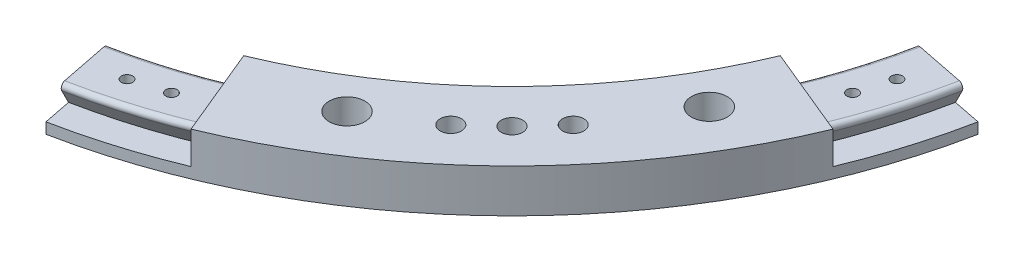
ISO-10303-21;
HEADER;
FILE_DESCRIPTION(('STEP AP214'),'2;1');
FILE_NAME('part.step','',(''),(''),'','','');
FILE_SCHEMA(('AUTOMOTIVE_DESIGN { 1 0 10303 214 1 1 1 1 }'));
ENDSEC;
DATA;
#1=APPLICATION_CONTEXT('core data for automotive mechanical design processes');
#2=APPLICATION_PROTOCOL_DEFINITION('international standard','automotive_design',2000,#1);
#3=PRODUCT_CONTEXT('',#1,'mechanical');
#4=PRODUCT('Part','Part','',(#3));
#5=PRODUCT_RELATED_PRODUCT_CATEGORY('part','',(#4));
#6=PRODUCT_DEFINITION_FORMATION('','',#4);
#7=PRODUCT_DEFINITION_CONTEXT('part definition',#1,'design');
#8=PRODUCT_DEFINITION('design','',#6,#7);
#9=PRODUCT_DEFINITION_SHAPE('','',#8);
#10=(LENGTH_UNIT() NAMED_UNIT(*) SI_UNIT(.MILLI.,.METRE.));
#11=(NAMED_UNIT(*) PLANE_ANGLE_UNIT() SI_UNIT($,.RADIAN.));
#12=(NAMED_UNIT(*) SI_UNIT($,.STERADIAN.) SOLID_ANGLE_UNIT());
#13=UNCERTAINTY_MEASURE_WITH_UNIT(LENGTH_MEASURE(1.E-05),#10,'distance_accuracy_value','');
#14=(GEOMETRIC_REPRESENTATION_CONTEXT(3) GLOBAL_UNCERTAINTY_ASSIGNED_CONTEXT((#13)) GLOBAL_UNIT_ASSIGNED_CONTEXT((#10,
#11,#12)) REPRESENTATION_CONTEXT('',''));
#15=CARTESIAN_POINT('',(0.,0.,0.));
#16=DIRECTION('',(0.,0.,1.));
#17=DIRECTION('',(1.,0.,0.));
#18=AXIS2_PLACEMENT_3D('',#15,#16,#17);
#19=CARTESIAN_POINT('',(137.027937995646,1064.895,79.1131168882874));
#20=DIRECTION('',(0.,1.,0.));
#21=DIRECTION('',(0.,0.,1.));
#22=AXIS2_PLACEMENT_3D('',#19,#20,#21);
#23=CYLINDRICAL_SURFACE('',#22,5.2451);
#24=CARTESIAN_POINT('',(137.027937995646,1052.19499999999,79.1131168882874));
#25=DIRECTION('',(0.,1.,0.));
#26=DIRECTION('',(0.,0.,1.));
#27=AXIS2_PLACEMENT_3D('',#24,#25,#26);
#28=CIRCLE('',#27,5.2451);
#29=CARTESIAN_POINT('',(137.027937995646,1052.19499999999,84.3582168882874));
#30=VERTEX_POINT('',#29);
#31=EDGE_CURVE('E134',#30,#30,#28,.T.);
#32=ORIENTED_EDGE('',*,*,#31,.F.);
#33=EDGE_LOOP('',(#32));
#34=FACE_BOUND('',#33,.T.);
#35=CARTESIAN_POINT('',(137.027937995646,1064.895,79.1131168882874));
#36=DIRECTION('',(0.,1.,0.));
#37=DIRECTION('',(0.,0.,1.));
#38=AXIS2_PLACEMENT_3D('',#35,#36,#37);
#39=CIRCLE('',#38,5.2451);
#40=CARTESIAN_POINT('',(137.027937995646,1064.895,84.3582168882874));
#41=VERTEX_POINT('',#40);
#42=EDGE_CURVE('E320',#41,#41,#39,.T.);
#43=ORIENTED_EDGE('',*,*,#42,.T.);
#44=EDGE_LOOP('',(#43));
#45=FACE_BOUND('',#44,.T.);
#46=ADVANCED_FACE('F37',(#34,#45),#23,.F.);
#47=CARTESIAN_POINT('',(85.0148934383427,1064.895,133.446652070354));
#48=DIRECTION('',(0.,1.,0.));
#49=DIRECTION('',(0.,0.,1.));
#50=AXIS2_PLACEMENT_3D('',#47,#48,#49);
#51=CYLINDRICAL_SURFACE('',#50,5.2451);
#52=CARTESIAN_POINT('',(85.0148934383427,1052.19499999999,133.446652070354));
#53=DIRECTION('',(0.,1.,0.));
#54=DIRECTION('',(0.,0.,1.));
#55=AXIS2_PLACEMENT_3D('',#52,#53,#54);
#56=CIRCLE('',#55,5.2451);
#57=CARTESIAN_POINT('',(85.0148934383427,1052.19499999999,138.691752070354));
#58=VERTEX_POINT('',#57);
#59=EDGE_CURVE('E137',#58,#58,#56,.T.);
#60=ORIENTED_EDGE('',*,*,#59,.F.);
#61=EDGE_LOOP('',(#60));
#62=FACE_BOUND('',#61,.T.);
#63=CARTESIAN_POINT('',(85.0148934383427,1064.895,133.446652070354));
#64=DIRECTION('',(0.,1.,0.));
#65=DIRECTION('',(0.,0.,1.));
#66=AXIS2_PLACEMENT_3D('',#63,#64,#65);
#67=CIRCLE('',#66,5.2451);
#68=CARTESIAN_POINT('',(85.0148934383427,1064.895,138.691752070354));
#69=VERTEX_POINT('',#68);
#70=EDGE_CURVE('E290',#69,#69,#67,.T.);
#71=ORIENTED_EDGE('',*,*,#70,.T.);
#72=EDGE_LOOP('',(#71));
#73=FACE_BOUND('',#72,.T.);
#74=ADVANCED_FACE('F405',(#62,#73),#51,.F.);
#75=CARTESIAN_POINT('',(103.667734326181,1052.195,121.628246568323));
#76=DIRECTION('',(0.,-1.,0.));
#77=DIRECTION('',(0.,0.,-1.));
#78=AXIS2_PLACEMENT_3D('',#75,#76,#77);
#79=CYLINDRICAL_SURFACE('',#78,3.12419999999999);
#80=CARTESIAN_POINT('',(103.667734326181,1064.895,121.628246568323));
#81=DIRECTION('',(0.,-1.,0.));
#82=DIRECTION('',(0.,0.,-1.));
#83=AXIS2_PLACEMENT_3D('',#80,#81,#82);
#84=CIRCLE('',#83,3.12419999999999);
#85=CARTESIAN_POINT('',(103.667734326181,1064.895,118.504046568323));
#86=VERTEX_POINT('',#85);
#87=EDGE_CURVE('E272',#86,#86,#84,.T.);
#88=ORIENTED_EDGE('',*,*,#87,.F.);
#89=EDGE_LOOP('',(#88));
#90=FACE_BOUND('',#89,.T.);
#91=CARTESIAN_POINT('',(103.667734326181,1052.195,121.628246568323));
#92=DIRECTION('',(0.,-1.,0.));
#93=DIRECTION('',(0.,0.,-1.));
#94=AXIS2_PLACEMENT_3D('',#91,#92,#93);
#95=CIRCLE('',#94,3.12419999999999);
#96=CARTESIAN_POINT('',(103.667734326181,1052.195,118.504046568323));
#97=VERTEX_POINT('',#96);
#98=EDGE_CURVE('E287',#97,#97,#95,.T.);
#99=ORIENTED_EDGE('',*,*,#98,.T.);
#100=EDGE_LOOP('',(#99));
#101=FACE_BOUND('',#100,.T.);
#102=ADVANCED_FACE('F411',(#90,#101),#79,.F.);
#103=CARTESIAN_POINT('',(121.628246568319,1052.195,103.667734326185));
#104=DIRECTION('',(0.,-1.,0.));
#105=DIRECTION('',(0.,0.,-1.));
#106=AXIS2_PLACEMENT_3D('',#103,#104,#105);
#107=CYLINDRICAL_SURFACE('',#106,3.12419999999999);
#108=CARTESIAN_POINT('',(121.628246568319,1064.895,103.667734326185));
#109=DIRECTION('',(0.,-1.,0.));
#110=DIRECTION('',(0.,0.,-1.));
#111=AXIS2_PLACEMENT_3D('',#108,#109,#110);
#112=CIRCLE('',#111,3.12419999999999);
#113=CARTESIAN_POINT('',(121.628246568319,1064.895,100.543534326185));
#114=VERTEX_POINT('',#113);
#115=EDGE_CURVE('E274',#114,#114,#112,.T.);
#116=ORIENTED_EDGE('',*,*,#115,.F.);
#117=EDGE_LOOP('',(#116));
#118=FACE_BOUND('',#117,.T.);
#119=CARTESIAN_POINT('',(121.628246568319,1052.195,103.667734326185));
#120=DIRECTION('',(0.,-1.,0.));
#121=DIRECTION('',(0.,0.,-1.));
#122=AXIS2_PLACEMENT_3D('',#119,#120,#121);
#123=CIRCLE('',#122,3.12419999999999);
#124=CARTESIAN_POINT('',(121.628246568319,1052.195,100.543534326185));
#125=VERTEX_POINT('',#124);
#126=EDGE_CURVE('E282',#125,#125,#123,.T.);
#127=ORIENTED_EDGE('',*,*,#126,.T.);
#128=EDGE_LOOP('',(#127));
#129=FACE_BOUND('',#128,.T.);
#130=ADVANCED_FACE('F510',(#118,#129),#107,.F.);
#131=CARTESIAN_POINT('',(113.005374880152,1052.195,113.005374880156));
#132=DIRECTION('',(0.,-1.,0.));
#133=DIRECTION('',(0.,0.,-1.));
#134=AXIS2_PLACEMENT_3D('',#131,#132,#133);
#135=CYLINDRICAL_SURFACE('',#134,3.12419999999999);
#136=CARTESIAN_POINT('',(113.005374880152,1064.895,113.005374880156));
#137=DIRECTION('',(0.,-1.,0.));
#138=DIRECTION('',(0.,0.,-1.));
#139=AXIS2_PLACEMENT_3D('',#136,#137,#138);
#140=CIRCLE('',#139,3.12419999999999);
#141=CARTESIAN_POINT('',(113.005374880152,1064.895,109.881174880156));
#142=VERTEX_POINT('',#141);
#143=EDGE_CURVE('E271',#142,#142,#140,.T.);
#144=ORIENTED_EDGE('',*,*,#143,.F.);
#145=EDGE_LOOP('',(#144));
#146=FACE_BOUND('',#145,.T.);
#147=CARTESIAN_POINT('',(113.005374880152,1052.195,113.005374880156));
#148=DIRECTION('',(0.,-1.,0.));
#149=DIRECTION('',(0.,0.,-1.));
#150=AXIS2_PLACEMENT_3D('',#147,#148,#149);
#151=CIRCLE('',#150,3.12419999999999);
#152=CARTESIAN_POINT('',(113.005374880152,1052.195,109.881174880156));
#153=VERTEX_POINT('',#152);
#154=EDGE_CURVE('E277',#153,#153,#151,.T.);
#155=ORIENTED_EDGE('',*,*,#154,.T.);
#156=EDGE_LOOP('',(#155));
#157=FACE_BOUND('',#156,.T.);
#158=ADVANCED_FACE('F435',(#146,#157),#135,.F.);
#159=CARTESIAN_POINT('',(0.,1064.895,0.));
#160=DIRECTION('',(0.,1.,0.));
#161=DIRECTION('',(-1.,0.,0.));
#162=AXIS2_PLACEMENT_3D('',#159,#160,#161);
#163=PLANE('',#162);
#164=ORIENTED_EDGE('',*,*,#42,.F.);
#165=EDGE_LOOP('',(#164));
#166=FACE_BOUND('',#165,.T.);
#167=ORIENTED_EDGE('',*,*,#70,.F.);
#168=EDGE_LOOP('',(#167));
#169=FACE_BOUND('',#168,.T.);
#170=ORIENTED_EDGE('',*,*,#87,.T.);
#171=EDGE_LOOP('',(#170));
#172=FACE_BOUND('',#171,.T.);
#173=DIRECTION('',(0.923879532511286,0.,0.382683432365091));
#174=VECTOR('',#173,1.);
#175=CARTESIAN_POINT('',(160.848566471137,1064.895,66.6256577206168));
#176=LINE('',#175,#174);
#177=CARTESIAN_POINT('',(134.448708829627,1064.895,55.6904786407844));
#178=VERTEX_POINT('',#177);
#179=CARTESIAN_POINT('',(160.848566471137,1064.895,66.6256577206168));
#180=VERTEX_POINT('',#179);
#181=EDGE_CURVE('E248',#178,#180,#176,.T.);
#182=ORIENTED_EDGE('',*,*,#181,.F.);
#183=CARTESIAN_POINT('',(-3.72415348559597E-12,1064.895,0.));
#184=DIRECTION('',(0.,1.,0.));
#185=DIRECTION('',(-1.,0.,0.));
#186=AXIS2_PLACEMENT_3D('',#183,#184,#185);
#187=CIRCLE('',#186,145.526233776575);
#188=CARTESIAN_POINT('',(55.6904786407806,1064.895,134.44870882963));
#189=VERTEX_POINT('',#188);
#190=EDGE_CURVE('E142',#189,#178,#187,.T.);
#191=ORIENTED_EDGE('',*,*,#190,.F.);
#192=DIRECTION('',(-0.382683432365091,0.,-0.923879532511286));
#193=VECTOR('',#192,1.);
#194=CARTESIAN_POINT('',(55.6904786407806,1064.895,134.44870882963));
#195=LINE('',#194,#193);
#196=CARTESIAN_POINT('',(66.6256577206131,1064.895,160.84856647114));
#197=VERTEX_POINT('',#196);
#198=EDGE_CURVE('E270',#197,#189,#195,.T.);
#199=ORIENTED_EDGE('',*,*,#198,.F.);
#200=CARTESIAN_POINT('',(-3.72415348559597E-12,1064.895,0.));
#201=DIRECTION('',(0.,1.,0.));
#202=DIRECTION('',(-1.,0.,0.));
#203=AXIS2_PLACEMENT_3D('',#200,#201,#202);
#204=CIRCLE('',#203,174.101233776575);
#205=EDGE_CURVE('E41',#197,#180,#204,.T.);
#206=ORIENTED_EDGE('',*,*,#205,.T.);
#207=EDGE_LOOP('',(#182,#191,#199,#206));
#208=FACE_BOUND('',#207,.T.);
#209=ORIENTED_EDGE('',*,*,#143,.T.);
#210=EDGE_LOOP('',(#209));
#211=FACE_BOUND('',#210,.T.);
#212=ORIENTED_EDGE('',*,*,#115,.T.);
#213=EDGE_LOOP('',(#212));
#214=FACE_BOUND('',#213,.T.);
#215=ADVANCED_FACE('F267',(#166,#169,#172,#208,#211,#214),#163,.T.);
#216=CARTESIAN_POINT('',(154.368212850473,1061.72,41.3628379703278));
#217=DIRECTION('',(0.,1.,0.));
#218=DIRECTION('',(0.,0.,1.));
#219=AXIS2_PLACEMENT_3D('',#216,#217,#218);
#220=CYLINDRICAL_SURFACE('',#219,1.64999999999998);
#221=CARTESIAN_POINT('',(154.368212850473,1052.19499999999,41.3628379703278));
#222=DIRECTION('',(0.,1.,0.));
#223=DIRECTION('',(0.,0.,1.));
#224=AXIS2_PLACEMENT_3D('',#221,#222,#223);
#225=CIRCLE('',#224,1.64999999999998);
#226=CARTESIAN_POINT('',(154.368212850473,1052.19499999999,43.0128379703278));
#227=VERTEX_POINT('',#226);
#228=EDGE_CURVE('E303',#227,#227,#225,.T.);
#229=ORIENTED_EDGE('',*,*,#228,.F.);
#230=EDGE_LOOP('',(#229));
#231=FACE_BOUND('',#230,.T.);
#232=CARTESIAN_POINT('',(154.368212850473,1061.72,41.3628379703278));
#233=DIRECTION('',(0.,1.,0.));
#234=DIRECTION('',(0.,0.,1.));
#235=AXIS2_PLACEMENT_3D('',#232,#233,#234);
#236=CIRCLE('',#235,1.64999999999998);
#237=CARTESIAN_POINT('',(154.368212850473,1061.72,43.0128379703278));
#238=VERTEX_POINT('',#237);
#239=EDGE_CURVE('E310',#238,#238,#236,.T.);
#240=ORIENTED_EDGE('',*,*,#239,.T.);
#241=EDGE_LOOP('',(#240));
#242=FACE_BOUND('',#241,.T.);
#243=ADVANCED_FACE('F434',(#231,#242),#220,.F.);
#244=CARTESIAN_POINT('',(151.332439620143,1061.72,51.3704411332491));
#245=DIRECTION('',(0.,1.,0.));
#246=DIRECTION('',(0.,0.,1.));
#247=AXIS2_PLACEMENT_3D('',#244,#245,#246);
#248=CYLINDRICAL_SURFACE('',#247,1.64999999999998);
#249=CARTESIAN_POINT('',(151.332439620143,1052.19499999999,51.3704411332491));
#250=DIRECTION('',(0.,1.,0.));
#251=DIRECTION('',(0.,0.,1.));
#252=AXIS2_PLACEMENT_3D('',#249,#250,#251);
#253=CIRCLE('',#252,1.64999999999998);
#254=CARTESIAN_POINT('',(151.332439620143,1052.19499999999,53.0204411332491));
#255=VERTEX_POINT('',#254);
#256=EDGE_CURVE('E309',#255,#255,#253,.T.);
#257=ORIENTED_EDGE('',*,*,#256,.F.);
#258=EDGE_LOOP('',(#257));
#259=FACE_BOUND('',#258,.T.);
#260=CARTESIAN_POINT('',(151.332439620143,1061.72,51.3704411332491));
#261=DIRECTION('',(0.,1.,0.));
#262=DIRECTION('',(0.,0.,1.));
#263=AXIS2_PLACEMENT_3D('',#260,#261,#262);
#264=CIRCLE('',#263,1.64999999999998);
#265=CARTESIAN_POINT('',(151.332439620143,1061.72,53.0204411332491));
#266=VERTEX_POINT('',#265);
#267=EDGE_CURVE('E306',#266,#266,#264,.T.);
#268=ORIENTED_EDGE('',*,*,#267,.T.);
#269=EDGE_LOOP('',(#268));
#270=FACE_BOUND('',#269,.T.);
#271=ADVANCED_FACE('F534',(#259,#270),#248,.F.);
#272=CARTESIAN_POINT('',(51.3704411332396,1061.72,151.332439620146));
#273=DIRECTION('',(0.,1.,0.));
#274=DIRECTION('',(0.,0.,1.));
#275=AXIS2_PLACEMENT_3D('',#272,#273,#274);
#276=CYLINDRICAL_SURFACE('',#275,1.64999999999999);
#277=CARTESIAN_POINT('',(51.3704411332396,1052.195,151.332439620146));
#278=DIRECTION('',(0.,1.,0.));
#279=DIRECTION('',(0.,0.,1.));
#280=AXIS2_PLACEMENT_3D('',#277,#278,#279);
#281=CIRCLE('',#280,1.65);
#282=CARTESIAN_POINT('',(51.3704411332396,1052.195,152.982439620146));
#283=VERTEX_POINT('',#282);
#284=EDGE_CURVE('E294',#283,#283,#281,.T.);
#285=ORIENTED_EDGE('',*,*,#284,.F.);
#286=EDGE_LOOP('',(#285));
#287=FACE_BOUND('',#286,.T.);
#288=CARTESIAN_POINT('',(51.3704411332396,1061.72,151.332439620146));
#289=DIRECTION('',(0.,1.,0.));
#290=DIRECTION('',(0.,0.,1.));
#291=AXIS2_PLACEMENT_3D('',#288,#289,#290);
#292=CIRCLE('',#291,1.64999999999998);
#293=CARTESIAN_POINT('',(51.3704411332396,1061.72,152.982439620146));
#294=VERTEX_POINT('',#293);
#295=EDGE_CURVE('E300',#294,#294,#292,.T.);
#296=ORIENTED_EDGE('',*,*,#295,.T.);
#297=EDGE_LOOP('',(#296));
#298=FACE_BOUND('',#297,.T.);
#299=ADVANCED_FACE('F537',(#287,#298),#276,.F.);
#300=CARTESIAN_POINT('',(41.3628379703183,1061.72,154.368212850477));
#301=DIRECTION('',(0.,1.,0.));
#302=DIRECTION('',(0.,0.,1.));
#303=AXIS2_PLACEMENT_3D('',#300,#301,#302);
#304=CYLINDRICAL_SURFACE('',#303,1.65);
#305=CARTESIAN_POINT('',(41.3628379703183,1052.195,154.368212850477));
#306=DIRECTION('',(0.,1.,0.));
#307=DIRECTION('',(0.,0.,1.));
#308=AXIS2_PLACEMENT_3D('',#305,#306,#307);
#309=CIRCLE('',#308,1.65);
#310=CARTESIAN_POINT('',(41.3628379703183,1052.195,156.018212850477));
#311=VERTEX_POINT('',#310);
#312=EDGE_CURVE('E291',#311,#311,#309,.T.);
#313=ORIENTED_EDGE('',*,*,#312,.F.);
#314=EDGE_LOOP('',(#313));
#315=FACE_BOUND('',#314,.T.);
#316=CARTESIAN_POINT('',(41.3628379703183,1061.72,154.368212850477));
#317=DIRECTION('',(0.,1.,0.));
#318=DIRECTION('',(0.,0.,1.));
#319=AXIS2_PLACEMENT_3D('',#316,#317,#318);
#320=CIRCLE('',#319,1.64999999999999);
#321=CARTESIAN_POINT('',(41.3628379703183,1061.72,156.018212850477));
#322=VERTEX_POINT('',#321);
#323=EDGE_CURVE('E296',#322,#322,#320,.T.);
#324=ORIENTED_EDGE('',*,*,#323,.T.);
#325=EDGE_LOOP('',(#324));
#326=FACE_BOUND('',#325,.T.);
#327=ADVANCED_FACE('F550',(#315,#326),#304,.F.);
#328=CARTESIAN_POINT('',(160.848566471137,1055.37,66.6256577206168));
#329=DIRECTION('',(-0.382683432365091,0.,0.923879532511286));
#330=DIRECTION('',(0.923879532511286,0.,0.382683432365091));
#331=AXIS2_PLACEMENT_3D('',#328,#329,#330);
#332=PLANE('',#331);
#333=DIRECTION('',(0.461939766255634,0.866025403784444,0.191341716182543));
#334=VECTOR('',#333,1.);
#335=CARTESIAN_POINT('',(-3.9034376118677E-13,768.416709409576,9.42373202244822E-13));
#336=LINE('',#335,#334);
#337=CARTESIAN_POINT('',(153.061486882916,1055.37,63.4001437438969));
#338=VERTEX_POINT('',#337);
#339=CARTESIAN_POINT('',(155.432459203165,1059.815,64.3822326349556));
#340=VERTEX_POINT('',#339);
#341=EDGE_CURVE('E299',#338,#340,#336,.T.);
#342=ORIENTED_EDGE('',*,*,#341,.T.);
#343=CARTESIAN_POINT('',(154.416328208773,1060.45,63.9613373959291));
#344=DIRECTION('',(-0.382683432365091,0.,0.923879532511286));
#345=DIRECTION('',(0.923879532511286,0.,0.382683432365091));
#346=AXIS2_PLACEMENT_3D('',#343,#344,#345);
#347=CIRCLE('',#346,1.27);
#348=CARTESIAN_POINT('',(154.416328208772,1061.72,63.9613373959304));
#349=VERTEX_POINT('',#348);
#350=EDGE_CURVE('E377',#340,#349,#347,.T.);
#351=ORIENTED_EDGE('',*,*,#350,.T.);
#352=DIRECTION('',(-0.923879532511286,0.,-0.382683432365091));
#353=VECTOR('',#352,1.);
#354=CARTESIAN_POINT('',(160.848566471137,1061.72,66.6256577206168));
#355=LINE('',#354,#353);
#356=CARTESIAN_POINT('',(140.880947092004,1061.72,58.3547989654763));
#357=VERTEX_POINT('',#356);
#358=EDGE_CURVE('E380',#349,#357,#355,.T.);
#359=ORIENTED_EDGE('',*,*,#358,.T.);
#360=CARTESIAN_POINT('',(140.880947092005,1060.45,58.354798965475));
#361=DIRECTION('',(-0.382683432365091,0.,0.923879532511286));
#362=DIRECTION('',(0.923879532511286,0.,0.382683432365091));
#363=AXIS2_PLACEMENT_3D('',#360,#361,#362);
#364=CIRCLE('',#363,1.27);
#365=CARTESIAN_POINT('',(139.864816097611,1059.815,57.9339037264511));
#366=VERTEX_POINT('',#365);
#367=EDGE_CURVE('E251',#357,#366,#364,.T.);
#368=ORIENTED_EDGE('',*,*,#367,.T.);
#369=DIRECTION('',(-0.461939766255647,0.866025403784437,-0.191341716182546));
#370=VECTOR('',#369,1.);
#371=CARTESIAN_POINT('',(-6.71816133198999E-13,1322.02772270622,1.62190762019007E-12));
#372=LINE('',#371,#370);
#373=CARTESIAN_POINT('',(142.235788417861,1055.37,58.9159926175096));
#374=VERTEX_POINT('',#373);
#375=EDGE_CURVE('E245',#366,#374,#372,.F.);
#376=ORIENTED_EDGE('',*,*,#375,.T.);
#377=DIRECTION('',(0.923879532511286,0.,0.382683432365091));
#378=VECTOR('',#377,1.);
#379=CARTESIAN_POINT('',(160.848566471137,1055.37,66.6256577206168));
#380=LINE('',#379,#378);
#381=CARTESIAN_POINT('',(134.448708829627,1055.37,55.6904786407844));
#382=VERTEX_POINT('',#381);
#383=EDGE_CURVE('E215',#382,#374,#380,.T.);
#384=ORIENTED_EDGE('',*,*,#383,.F.);
#385=DIRECTION('',(0.,1.,0.));
#386=VECTOR('',#385,1.);
#387=CARTESIAN_POINT('',(134.448708829627,1055.37,55.6904786407844));
#388=LINE('',#387,#386);
#389=EDGE_CURVE('E241',#382,#178,#388,.T.);
#390=ORIENTED_EDGE('',*,*,#389,.T.);
#391=ORIENTED_EDGE('',*,*,#181,.T.);
#392=DIRECTION('',(0.,1.,0.));
#393=VECTOR('',#392,1.);
#394=CARTESIAN_POINT('',(160.848566471137,1055.37,66.6256577206168));
#395=LINE('',#394,#393);
#396=CARTESIAN_POINT('',(160.848566471137,1055.37,66.6256577206168));
#397=VERTEX_POINT('',#396);
#398=EDGE_CURVE('E149',#397,#180,#395,.T.);
#399=ORIENTED_EDGE('',*,*,#398,.F.);
#400=EDGE_CURVE('E209',#338,#397,#380,.T.);
#401=ORIENTED_EDGE('',*,*,#400,.F.);
#402=EDGE_LOOP('',(#342,#351,#359,#368,#376,#384,#390,#391,#399,#401));
#403=FACE_BOUND('',#402,.T.);
#404=ADVANCED_FACE('F238',(#403),#332,.F.);
#405=CARTESIAN_POINT('',(55.6904786407807,1055.37,134.44870882963));
#406=DIRECTION('',(0.923879532511286,0.,-0.38268343236509));
#407=DIRECTION('',(-0.382683432365091,0.,-0.923879532511287));
#408=AXIS2_PLACEMENT_3D('',#405,#406,#407);
#409=PLANE('',#408);
#410=DIRECTION('',(-0.382683432365091,0.,-0.923879532511286));
#411=VECTOR('',#410,1.);
#412=CARTESIAN_POINT('',(55.6904786407807,1055.37,134.44870882963));
#413=LINE('',#412,#411);
#414=CARTESIAN_POINT('',(58.9159926175052,1055.37,142.235788417863));
#415=VERTEX_POINT('',#414);
#416=CARTESIAN_POINT('',(55.6904786407807,1055.37,134.44870882963));
#417=VERTEX_POINT('',#416);
#418=EDGE_CURVE('E295',#415,#417,#413,.T.);
#419=ORIENTED_EDGE('',*,*,#418,.F.);
#420=DIRECTION('',(0.191341716182549,-0.866025403784437,0.461939766255646));
#421=VECTOR('',#420,1.);
#422=CARTESIAN_POINT('',(-3.93617106243756E-12,1322.02772270622,1.63041543788215E-12));
#423=LINE('',#422,#421);
#424=CARTESIAN_POINT('',(57.9339037264466,1059.815,139.864816097613));
#425=VERTEX_POINT('',#424);
#426=EDGE_CURVE('E250',#415,#425,#423,.F.);
#427=ORIENTED_EDGE('',*,*,#426,.T.);
#428=CARTESIAN_POINT('',(58.354798965475,1060.45,140.880947092005));
#429=DIRECTION('',(0.923879532511286,0.,-0.38268343236509));
#430=DIRECTION('',(-0.382683432365091,0.,-0.923879532511287));
#431=AXIS2_PLACEMENT_3D('',#428,#429,#430);
#432=CIRCLE('',#431,1.27);
#433=CARTESIAN_POINT('',(58.3547989654718,1061.72,140.880947092006));
#434=VERTEX_POINT('',#433);
#435=EDGE_CURVE('E375',#425,#434,#432,.T.);
#436=ORIENTED_EDGE('',*,*,#435,.T.);
#437=DIRECTION('',(0.382683432365091,0.,0.923879532511287));
#438=VECTOR('',#437,1.);
#439=CARTESIAN_POINT('',(55.6904786407807,1061.72,134.44870882963));
#440=LINE('',#439,#438);
#441=CARTESIAN_POINT('',(63.9613373959259,1061.72,154.416328208774));
#442=VERTEX_POINT('',#441);
#443=EDGE_CURVE('E371',#434,#442,#440,.T.);
#444=ORIENTED_EDGE('',*,*,#443,.T.);
#445=CARTESIAN_POINT('',(63.9613373959291,1060.45,154.416328208773));
#446=DIRECTION('',(0.923879532511286,0.,-0.38268343236509));
#447=DIRECTION('',(-0.382683432365091,0.,-0.923879532511287));
#448=AXIS2_PLACEMENT_3D('',#445,#446,#447);
#449=CIRCLE('',#448,1.27);
#450=CARTESIAN_POINT('',(64.3822326349512,1059.815,155.432459203167));
#451=VERTEX_POINT('',#450);
#452=EDGE_CURVE('E367',#442,#451,#449,.T.);
#453=ORIENTED_EDGE('',*,*,#452,.T.);
#454=DIRECTION('',(-0.191341716182539,-0.866025403784444,-0.461939766255635));
#455=VECTOR('',#454,1.);
#456=CARTESIAN_POINT('',(-2.28220993196705E-12,768.416709409576,9.45322306003334E-13));
#457=LINE('',#456,#455);
#458=CARTESIAN_POINT('',(63.4001437438924,1055.37,153.061486882917));
#459=VERTEX_POINT('',#458);
#460=EDGE_CURVE('E359',#451,#459,#457,.T.);
#461=ORIENTED_EDGE('',*,*,#460,.T.);
#462=CARTESIAN_POINT('',(66.6256577206131,1055.37,160.84856647114));
#463=VERTEX_POINT('',#462);
#464=EDGE_CURVE('E153',#463,#459,#413,.T.);
#465=ORIENTED_EDGE('',*,*,#464,.F.);
#466=DIRECTION('',(0.,1.,0.));
#467=VECTOR('',#466,1.);
#468=CARTESIAN_POINT('',(66.6256577206131,1055.37,160.84856647114));
#469=LINE('',#468,#467);
#470=EDGE_CURVE('E373',#463,#197,#469,.T.);
#471=ORIENTED_EDGE('',*,*,#470,.T.);
#472=ORIENTED_EDGE('',*,*,#198,.T.);
#473=DIRECTION('',(0.,1.,0.));
#474=VECTOR('',#473,1.);
#475=CARTESIAN_POINT('',(55.6904786407807,1055.37,134.44870882963));
#476=LINE('',#475,#474);
#477=EDGE_CURVE('E145',#417,#189,#476,.T.);
#478=ORIENTED_EDGE('',*,*,#477,.F.);
#479=EDGE_LOOP('',(#419,#427,#436,#444,#453,#461,#465,#471,#472,#478));
#480=FACE_BOUND('',#479,.T.);
#481=ADVANCED_FACE('F385',(#480),#409,.F.);
#482=CARTESIAN_POINT('',(0.,1060.45,0.));
#483=DIRECTION('',(0.,1.,0.));
#484=DIRECTION('',(0.,0.,1.));
#485=AXIS2_PLACEMENT_3D('',#482,#483,#484);
#486=TOROIDAL_SURFACE('',#485,167.139029250966,1.27);
#487=CARTESIAN_POINT('',(0.,1061.72,0.));
#488=DIRECTION('',(0.,1.,0.));
#489=DIRECTION('',(0.,0.,1.));
#490=AXIS2_PLACEMENT_3D('',#487,#488,#489);
#491=CIRCLE('',#490,167.139029250966);
#492=CARTESIAN_POINT('',(32.6072070380306,1061.72,163.927499670233));
#493=VERTEX_POINT('',#492);
#494=EDGE_CURVE('E165',#493,#442,#491,.T.);
#495=ORIENTED_EDGE('',*,*,#494,.F.);
#496=CARTESIAN_POINT('',(32.6072070380342,1060.45,163.927499670233));
#497=DIRECTION('',(-0.98078528040323,0.,0.195090322016129));
#498=DIRECTION('',(0.195090322016129,0.,0.98078528040323));
#499=AXIS2_PLACEMENT_3D('',#496,#497,#498);
#500=CIRCLE('',#499,1.27);
#501=CARTESIAN_POINT('',(32.8217775701552,1059.815,165.006218580211));
#502=VERTEX_POINT('',#501);
#503=EDGE_CURVE('E337',#493,#502,#500,.F.);
#504=ORIENTED_EDGE('',*,*,#503,.T.);
#505=CARTESIAN_POINT('',(0.,1059.815,0.));
#506=DIRECTION('',(0.,-1.,0.));
#507=DIRECTION('',(0.,0.,-1.));
#508=AXIS2_PLACEMENT_3D('',#505,#506,#507);
#509=CIRCLE('',#508,168.238881513773);
#510=EDGE_CURVE('E167',#451,#502,#509,.T.);
#511=ORIENTED_EDGE('',*,*,#510,.F.);
#512=ORIENTED_EDGE('',*,*,#452,.F.);
#513=EDGE_LOOP('',(#495,#504,#511,#512));
#514=FACE_BOUND('',#513,.T.);
#515=ADVANCED_FACE('F364',(#514),#486,.T.);
#516=CARTESIAN_POINT('',(0.,1060.45,0.));
#517=DIRECTION('',(0.,1.,0.));
#518=DIRECTION('',(0.,0.,1.));
#519=AXIS2_PLACEMENT_3D('',#516,#517,#518);
#520=TOROIDAL_SURFACE('',#519,152.488438302191,1.27);
#521=CARTESIAN_POINT('',(0.,1059.815,0.));
#522=DIRECTION('',(0.,1.,0.));
#523=DIRECTION('',(0.,0.,1.));
#524=AXIS2_PLACEMENT_3D('',#521,#522,#523);
#525=CIRCLE('',#524,151.388586039385);
#526=CARTESIAN_POINT('',(29.5344479999901,1059.815,148.479696808487));
#527=VERTEX_POINT('',#526);
#528=EDGE_CURVE('E158',#527,#425,#525,.T.);
#529=ORIENTED_EDGE('',*,*,#528,.F.);
#530=CARTESIAN_POINT('',(29.7490185321111,1060.45,149.558415718466));
#531=DIRECTION('',(-0.98078528040323,0.,0.195090322016129));
#532=DIRECTION('',(0.195090322016129,0.,0.98078528040323));
#533=AXIS2_PLACEMENT_3D('',#530,#531,#532);
#534=CIRCLE('',#533,1.27);
#535=CARTESIAN_POINT('',(29.7490185321111,1061.72,149.558415718466));
#536=VERTEX_POINT('',#535);
#537=EDGE_CURVE('E181',#527,#536,#534,.F.);
#538=ORIENTED_EDGE('',*,*,#537,.T.);
#539=CARTESIAN_POINT('',(0.,1061.72,0.));
#540=DIRECTION('',(0.,1.,0.));
#541=DIRECTION('',(0.,0.,1.));
#542=AXIS2_PLACEMENT_3D('',#539,#540,#541);
#543=CIRCLE('',#542,152.488438302191);
#544=EDGE_CURVE('E177',#434,#536,#543,.F.);
#545=ORIENTED_EDGE('',*,*,#544,.F.);
#546=ORIENTED_EDGE('',*,*,#435,.F.);
#547=EDGE_LOOP('',(#529,#538,#545,#546));
#548=FACE_BOUND('',#547,.T.);
#549=ADVANCED_FACE('F439',(#548),#520,.T.);
#550=CARTESIAN_POINT('',(0.,1061.72,0.));
#551=DIRECTION('',(0.,1.,0.));
#552=DIRECTION('',(0.,0.,1.));
#553=AXIS2_PLACEMENT_3D('',#550,#551,#552);
#554=PLANE('',#553);
#555=ORIENTED_EDGE('',*,*,#323,.F.);
#556=EDGE_LOOP('',(#555));
#557=FACE_BOUND('',#556,.T.);
#558=ORIENTED_EDGE('',*,*,#295,.F.);
#559=EDGE_LOOP('',(#558));
#560=FACE_BOUND('',#559,.T.);
#561=ORIENTED_EDGE('',*,*,#544,.T.);
#562=DIRECTION('',(0.195090322016129,0.,0.98078528040323));
#563=VECTOR('',#562,1.);
#564=CARTESIAN_POINT('',(-3.59881367963899E-12,1061.72,7.15848548775291E-13));
#565=LINE('',#564,#563);
#566=EDGE_CURVE('E168',#536,#493,#565,.T.);
#567=ORIENTED_EDGE('',*,*,#566,.T.);
#568=ORIENTED_EDGE('',*,*,#494,.T.);
#569=ORIENTED_EDGE('',*,*,#443,.F.);
#570=EDGE_LOOP('',(#561,#567,#568,#569));
#571=FACE_BOUND('',#570,.T.);
#572=ADVANCED_FACE('F442',(#557,#560,#571),#554,.T.);
#573=CARTESIAN_POINT('',(0.,1055.37,0.));
#574=DIRECTION('',(0.,1.,0.));
#575=DIRECTION('',(0.,0.,1.));
#576=AXIS2_PLACEMENT_3D('',#573,#574,#575);
#577=CONICAL_SURFACE('',#576,165.672559567225,0.523598775598288);
#578=ORIENTED_EDGE('',*,*,#510,.T.);
#579=DIRECTION('',(0.0975451610080595,0.866025403784444,0.490392640201606));
#580=VECTOR('',#579,1.);
#581=CARTESIAN_POINT('',(-2.61211261301332E-12,768.416709409576,5.19581503716744E-13));
#582=LINE('',#581,#580);
#583=CARTESIAN_POINT('',(32.3211129952026,1055.37,162.489207790262));
#584=VERTEX_POINT('',#583);
#585=EDGE_CURVE('E164',#502,#584,#582,.F.);
#586=ORIENTED_EDGE('',*,*,#585,.T.);
#587=CARTESIAN_POINT('',(0.,1055.37,0.));
#588=DIRECTION('',(0.,-1.,0.));
#589=DIRECTION('',(0.,0.,-1.));
#590=AXIS2_PLACEMENT_3D('',#587,#588,#589);
#591=CIRCLE('',#590,165.672559567225);
#592=EDGE_CURVE('E155',#459,#584,#591,.T.);
#593=ORIENTED_EDGE('',*,*,#592,.F.);
#594=ORIENTED_EDGE('',*,*,#460,.F.);
#595=EDGE_LOOP('',(#578,#586,#593,#594));
#596=FACE_BOUND('',#595,.T.);
#597=ADVANCED_FACE('F358',(#596),#577,.T.);
#598=CARTESIAN_POINT('',(0.,1061.72,0.));
#599=DIRECTION('',(0.,-1.,0.));
#600=DIRECTION('',(0.,0.,-1.));
#601=AXIS2_PLACEMENT_3D('',#598,#599,#600);
#602=CONICAL_SURFACE('',#601,150.288733776579,0.523598775598303);
#603=CARTESIAN_POINT('',(0.,1055.37,0.));
#604=DIRECTION('',(0.,-1.,0.));
#605=DIRECTION('',(0.,0.,-1.));
#606=AXIS2_PLACEMENT_3D('',#603,#604,#605);
#607=CIRCLE('',#606,153.954907985933);
#608=CARTESIAN_POINT('',(30.0351125749355,1055.37,150.996707598437));
#609=VERTEX_POINT('',#608);
#610=EDGE_CURVE('E162',#415,#609,#607,.T.);
#611=ORIENTED_EDGE('',*,*,#610,.T.);
#612=DIRECTION('',(-0.0975451610080679,0.866025403784437,-0.490392640201618));
#613=VECTOR('',#612,1.);
#614=CARTESIAN_POINT('',(-4.47451441633409E-12,1322.02772270622,8.90036255427425E-13));
#615=LINE('',#614,#613);
#616=EDGE_CURVE('E161',#609,#527,#615,.T.);
#617=ORIENTED_EDGE('',*,*,#616,.T.);
#618=ORIENTED_EDGE('',*,*,#528,.T.);
#619=ORIENTED_EDGE('',*,*,#426,.F.);
#620=EDGE_LOOP('',(#611,#617,#618,#619));
#621=FACE_BOUND('',#620,.T.);
#622=ADVANCED_FACE('F403',(#621),#602,.F.);
#623=CARTESIAN_POINT('',(-3.69084263152089E-12,1055.37,0.));
#624=DIRECTION('',(0.,1.,0.));
#625=DIRECTION('',(-1.,0.,0.));
#626=AXIS2_PLACEMENT_3D('',#623,#624,#625);
#627=PLANE('',#626);
#628=ORIENTED_EDGE('',*,*,#592,.T.);
#629=DIRECTION('',(0.195090322016129,0.,0.98078528040323));
#630=VECTOR('',#629,1.);
#631=CARTESIAN_POINT('',(-3.71792598945314E-12,1055.37,0.));
#632=LINE('',#631,#630);
#633=CARTESIAN_POINT('',(33.9654657608736,1055.37,170.755927388107));
#634=VERTEX_POINT('',#633);
#635=EDGE_CURVE('E154',#584,#634,#632,.T.);
#636=ORIENTED_EDGE('',*,*,#635,.T.);
#637=CARTESIAN_POINT('',(-3.69084263152089E-12,1055.37,0.));
#638=DIRECTION('',(0.,1.,0.));
#639=DIRECTION('',(-1.,0.,0.));
#640=AXIS2_PLACEMENT_3D('',#637,#638,#639);
#641=CIRCLE('',#640,174.101233776575);
#642=EDGE_CURVE('E150',#634,#463,#641,.T.);
#643=ORIENTED_EDGE('',*,*,#642,.T.);
#644=ORIENTED_EDGE('',*,*,#464,.T.);
#645=EDGE_LOOP('',(#628,#636,#643,#644));
#646=FACE_BOUND('',#645,.T.);
#647=ADVANCED_FACE('F349',(#646),#627,.T.);
#648=CARTESIAN_POINT('',(0.,1060.45,0.));
#649=DIRECTION('',(0.,1.,0.));
#650=DIRECTION('',(0.,0.,1.));
#651=AXIS2_PLACEMENT_3D('',#648,#649,#650);
#652=TOROIDAL_SURFACE('',#651,167.139029250966,1.27);
#653=CARTESIAN_POINT('',(163.927499670233,1060.45,32.6072070380342));
#654=DIRECTION('',(-0.195090322016128,0.,0.98078528040323));
#655=DIRECTION('',(0.980785280403231,0.,0.195090322016129));
#656=AXIS2_PLACEMENT_3D('',#653,#654,#655);
#657=CIRCLE('',#656,1.27);
#658=CARTESIAN_POINT('',(163.927499670233,1061.72,32.6072070380348));
#659=VERTEX_POINT('',#658);
#660=CARTESIAN_POINT('',(165.006218580211,1059.815,32.8217775701552));
#661=VERTEX_POINT('',#660);
#662=EDGE_CURVE('E47',#659,#661,#657,.F.);
#663=ORIENTED_EDGE('',*,*,#662,.F.);
#664=CARTESIAN_POINT('',(0.,1061.72,0.));
#665=DIRECTION('',(0.,1.,0.));
#666=DIRECTION('',(0.,0.,1.));
#667=AXIS2_PLACEMENT_3D('',#664,#665,#666);
#668=CIRCLE('',#667,167.139029250966);
#669=EDGE_CURVE('E197',#349,#659,#668,.T.);
#670=ORIENTED_EDGE('',*,*,#669,.F.);
#671=ORIENTED_EDGE('',*,*,#350,.F.);
#672=CARTESIAN_POINT('',(0.,1059.815,0.));
#673=DIRECTION('',(0.,-1.,0.));
#674=DIRECTION('',(0.,0.,-1.));
#675=AXIS2_PLACEMENT_3D('',#672,#673,#674);
#676=CIRCLE('',#675,168.238881513773);
#677=EDGE_CURVE('E195',#661,#340,#676,.T.);
#678=ORIENTED_EDGE('',*,*,#677,.F.);
#679=EDGE_LOOP('',(#663,#670,#671,#678));
#680=FACE_BOUND('',#679,.T.);
#681=ADVANCED_FACE('F402',(#680),#652,.T.);
#682=CARTESIAN_POINT('',(0.,1060.45,0.));
#683=DIRECTION('',(0.,1.,0.));
#684=DIRECTION('',(0.,0.,1.));
#685=AXIS2_PLACEMENT_3D('',#682,#683,#684);
#686=TOROIDAL_SURFACE('',#685,152.488438302191,1.27);
#687=CARTESIAN_POINT('',(149.558415718466,1060.45,29.7490185321111));
#688=DIRECTION('',(-0.195090322016128,0.,0.98078528040323));
#689=DIRECTION('',(0.980785280403231,0.,0.195090322016129));
#690=AXIS2_PLACEMENT_3D('',#687,#688,#689);
#691=CIRCLE('',#690,1.27);
#692=CARTESIAN_POINT('',(148.479696808487,1059.815,29.53444799999));
#693=VERTEX_POINT('',#692);
#694=CARTESIAN_POINT('',(149.558415718466,1061.72,29.7490185321111));
#695=VERTEX_POINT('',#694);
#696=EDGE_CURVE('E331',#693,#695,#691,.F.);
#697=ORIENTED_EDGE('',*,*,#696,.F.);
#698=CARTESIAN_POINT('',(0.,1059.815,0.));
#699=DIRECTION('',(0.,1.,0.));
#700=DIRECTION('',(0.,0.,1.));
#701=AXIS2_PLACEMENT_3D('',#698,#699,#700);
#702=CIRCLE('',#701,151.388586039385);
#703=EDGE_CURVE('E192',#366,#693,#702,.T.);
#704=ORIENTED_EDGE('',*,*,#703,.F.);
#705=ORIENTED_EDGE('',*,*,#367,.F.);
#706=CARTESIAN_POINT('',(0.,1061.72,0.));
#707=DIRECTION('',(0.,1.,0.));
#708=DIRECTION('',(0.,0.,1.));
#709=AXIS2_PLACEMENT_3D('',#706,#707,#708);
#710=CIRCLE('',#709,152.488438302191);
#711=EDGE_CURVE('E200',#695,#357,#710,.F.);
#712=ORIENTED_EDGE('',*,*,#711,.F.);
#713=EDGE_LOOP('',(#697,#704,#705,#712));
#714=FACE_BOUND('',#713,.T.);
#715=ADVANCED_FACE('F424',(#714),#686,.T.);
#716=DIRECTION('',(0.980785280403231,0.,0.195090322016129));
#717=VECTOR('',#716,1.);
#718=CARTESIAN_POINT('',(-1.33737685208878E-13,1061.72,6.72344746436087E-13));
#719=LINE('',#718,#717);
#720=EDGE_CURVE('E326',#695,#659,#719,.T.);
#721=ORIENTED_EDGE('',*,*,#720,.F.);
#722=ORIENTED_EDGE('',*,*,#711,.T.);
#723=ORIENTED_EDGE('',*,*,#358,.F.);
#724=ORIENTED_EDGE('',*,*,#669,.T.);
#725=EDGE_LOOP('',(#721,#722,#723,#724));
#726=FACE_BOUND('',#725,.T.);
#727=ORIENTED_EDGE('',*,*,#267,.F.);
#728=EDGE_LOOP('',(#727));
#729=FACE_BOUND('',#728,.T.);
#730=ORIENTED_EDGE('',*,*,#239,.F.);
#731=EDGE_LOOP('',(#730));
#732=FACE_BOUND('',#731,.T.);
#733=ADVANCED_FACE('F427',(#726,#729,#732),#554,.T.);
#734=DIRECTION('',(-0.490392640201619,0.866025403784437,-0.0975451610080644));
#735=VECTOR('',#734,1.);
#736=CARTESIAN_POINT('',(-1.68385774307487E-13,1322.02772270622,8.46532453088221E-13));
#737=LINE('',#736,#735);
#738=CARTESIAN_POINT('',(150.996707598436,1055.37,30.0351125749396));
#739=VERTEX_POINT('',#738);
#740=EDGE_CURVE('E328',#739,#693,#737,.T.);
#741=ORIENTED_EDGE('',*,*,#740,.F.);
#742=CARTESIAN_POINT('',(-3.10852020614596E-13,1055.37,0.));
#743=DIRECTION('',(0.,1.,0.));
#744=DIRECTION('',(-1.,0.,0.));
#745=AXIS2_PLACEMENT_3D('',#742,#743,#744);
#746=CIRCLE('',#745,153.954907985933);
#747=EDGE_CURVE('E196',#739,#374,#746,.F.);
#748=ORIENTED_EDGE('',*,*,#747,.T.);
#749=ORIENTED_EDGE('',*,*,#375,.F.);
#750=ORIENTED_EDGE('',*,*,#703,.T.);
#751=EDGE_LOOP('',(#741,#748,#749,#750));
#752=FACE_BOUND('',#751,.T.);
#753=ADVANCED_FACE('F446',(#752),#602,.F.);
#754=DIRECTION('',(0.490392640201606,0.866025403784444,0.0975451610080629));
#755=VECTOR('',#754,1.);
#756=CARTESIAN_POINT('',(0.,768.416709409576,4.76077701377541E-13));
#757=LINE('',#756,#755);
#758=CARTESIAN_POINT('',(162.489207790263,1055.37,32.3211129952071));
#759=VERTEX_POINT('',#758);
#760=EDGE_CURVE('E11',#661,#759,#757,.F.);
#761=ORIENTED_EDGE('',*,*,#760,.F.);
#762=ORIENTED_EDGE('',*,*,#677,.T.);
#763=ORIENTED_EDGE('',*,*,#341,.F.);
#764=CARTESIAN_POINT('',(-3.34511257715594E-13,1055.37,0.));
#765=DIRECTION('',(0.,1.,0.));
#766=DIRECTION('',(-1.,0.,0.));
#767=AXIS2_PLACEMENT_3D('',#764,#765,#766);
#768=CIRCLE('',#767,165.672559567225);
#769=EDGE_CURVE('E205',#338,#759,#768,.T.);
#770=ORIENTED_EDGE('',*,*,#769,.T.);
#771=EDGE_LOOP('',(#761,#762,#763,#770));
#772=FACE_BOUND('',#771,.T.);
#773=ADVANCED_FACE('F431',(#772),#577,.T.);
#774=CARTESIAN_POINT('',(-3.69084263152089E-12,1055.37,0.));
#775=DIRECTION('',(0.,1.,0.));
#776=DIRECTION('',(-1.,0.,0.));
#777=AXIS2_PLACEMENT_3D('',#774,#775,#776);
#778=PLANE('',#777);
#779=DIRECTION('',(0.980785280403231,0.,0.195090322016129));
#780=VECTOR('',#779,1.);
#781=CARTESIAN_POINT('',(-3.68326077086556E-12,1055.37,0.));
#782=LINE('',#781,#780);
#783=CARTESIAN_POINT('',(170.755927388103,1055.37,33.9654657608773));
#784=VERTEX_POINT('',#783);
#785=EDGE_CURVE('E131',#759,#784,#782,.T.);
#786=ORIENTED_EDGE('',*,*,#785,.F.);
#787=ORIENTED_EDGE('',*,*,#769,.F.);
#788=ORIENTED_EDGE('',*,*,#400,.T.);
#789=CARTESIAN_POINT('',(-3.69084263152089E-12,1055.37,0.));
#790=DIRECTION('',(0.,1.,0.));
#791=DIRECTION('',(-1.,0.,0.));
#792=AXIS2_PLACEMENT_3D('',#789,#790,#791);
#793=CIRCLE('',#792,174.101233776575);
#794=EDGE_CURVE('E190',#397,#784,#793,.T.);
#795=ORIENTED_EDGE('',*,*,#794,.T.);
#796=EDGE_LOOP('',(#786,#787,#788,#795));
#797=FACE_BOUND('',#796,.T.);
#798=ADVANCED_FACE('F398',(#797),#778,.T.);
#799=CARTESIAN_POINT('',(-3.93720365141906E-12,1125.81516808967,0.));
#800=DIRECTION('',(0.,1.,0.));
#801=DIRECTION('',(-1.,0.,0.));
#802=AXIS2_PLACEMENT_3D('',#799,#800,#801);
#803=CYLINDRICAL_SURFACE('',#802,174.101233776575);
#804=DIRECTION('',(0.,1.,0.));
#805=VECTOR('',#804,1.);
#806=CARTESIAN_POINT('',(170.755927388103,1052.19499999999,33.9654657608773));
#807=LINE('',#806,#805);
#808=CARTESIAN_POINT('',(170.755927388103,1052.19499999999,33.9654657608773));
#809=VERTEX_POINT('',#808);
#810=EDGE_CURVE('E108',#809,#784,#807,.T.);
#811=ORIENTED_EDGE('',*,*,#810,.T.);
#812=ORIENTED_EDGE('',*,*,#794,.F.);
#813=ORIENTED_EDGE('',*,*,#398,.T.);
#814=ORIENTED_EDGE('',*,*,#205,.F.);
#815=ORIENTED_EDGE('',*,*,#470,.F.);
#816=ORIENTED_EDGE('',*,*,#642,.F.);
#817=DIRECTION('',(0.,1.,0.));
#818=VECTOR('',#817,1.);
#819=CARTESIAN_POINT('',(33.9654657608736,1052.19499999999,170.755927388107));
#820=LINE('',#819,#818);
#821=CARTESIAN_POINT('',(33.9654657608736,1052.19499999999,170.755927388107));
#822=VERTEX_POINT('',#821);
#823=EDGE_CURVE('E186',#822,#634,#820,.T.);
#824=ORIENTED_EDGE('',*,*,#823,.F.);
#825=CARTESIAN_POINT('',(-3.67973901349586E-12,1052.195,0.));
#826=DIRECTION('',(0.,1.,0.));
#827=DIRECTION('',(-1.,0.,0.));
#828=AXIS2_PLACEMENT_3D('',#825,#826,#827);
#829=CIRCLE('',#828,174.101233776575);
#830=EDGE_CURVE('E146',#822,#809,#829,.T.);
#831=ORIENTED_EDGE('',*,*,#830,.T.);
#832=EDGE_LOOP('',(#811,#812,#813,#814,#815,#816,#824,#831));
#833=FACE_BOUND('',#832,.T.);
#834=ADVANCED_FACE('F260',(#833),#803,.T.);
#835=CARTESIAN_POINT('',(-3.93720365141906E-12,1125.81516808967,0.));
#836=DIRECTION('',(0.,1.,0.));
#837=DIRECTION('',(-1.,0.,0.));
#838=AXIS2_PLACEMENT_3D('',#835,#836,#837);
#839=CYLINDRICAL_SURFACE('',#838,145.526233776575);
#840=CARTESIAN_POINT('',(-3.69084263152089E-12,1055.37,0.));
#841=DIRECTION('',(0.,-1.,0.));
#842=DIRECTION('',(-1.,0.,0.));
#843=AXIS2_PLACEMENT_3D('',#840,#841,#842);
#844=CIRCLE('',#843,145.526233776575);
#845=CARTESIAN_POINT('',(142.729988000581,1055.37,28.3907598092664));
#846=VERTEX_POINT('',#845);
#847=EDGE_CURVE('E129',#846,#382,#844,.T.);
#848=ORIENTED_EDGE('',*,*,#847,.F.);
#849=DIRECTION('',(0.,1.,0.));
#850=VECTOR('',#849,1.);
#851=CARTESIAN_POINT('',(142.729988000581,1052.19499999999,28.3907598092664));
#852=LINE('',#851,#850);
#853=CARTESIAN_POINT('',(142.729988000581,1052.19499999999,28.3907598092664));
#854=VERTEX_POINT('',#853);
#855=EDGE_CURVE('E113',#854,#846,#852,.T.);
#856=ORIENTED_EDGE('',*,*,#855,.F.);
#857=CARTESIAN_POINT('',(-3.67973901349586E-12,1052.195,0.));
#858=DIRECTION('',(0.,1.,0.));
#859=DIRECTION('',(-1.,0.,0.));
#860=AXIS2_PLACEMENT_3D('',#857,#858,#859);
#861=CIRCLE('',#860,145.526233776575);
#862=CARTESIAN_POINT('',(28.3907598092628,1052.19499999999,142.729988000584));
#863=VERTEX_POINT('',#862);
#864=EDGE_CURVE('E120',#863,#854,#861,.T.);
#865=ORIENTED_EDGE('',*,*,#864,.F.);
#866=DIRECTION('',(0.,1.,0.));
#867=VECTOR('',#866,1.);
#868=CARTESIAN_POINT('',(28.3907598092628,1052.19499999999,142.729988000584));
#869=LINE('',#868,#867);
#870=CARTESIAN_POINT('',(28.3907598092628,1055.37,142.729988000584));
#871=VERTEX_POINT('',#870);
#872=EDGE_CURVE('E148',#863,#871,#869,.T.);
#873=ORIENTED_EDGE('',*,*,#872,.T.);
#874=CARTESIAN_POINT('',(-3.69084263152089E-12,1055.37,0.));
#875=DIRECTION('',(0.,-1.,0.));
#876=DIRECTION('',(-1.,0.,0.));
#877=AXIS2_PLACEMENT_3D('',#874,#875,#876);
#878=CIRCLE('',#877,145.526233776575);
#879=EDGE_CURVE('E223',#417,#871,#878,.T.);
#880=ORIENTED_EDGE('',*,*,#879,.F.);
#881=ORIENTED_EDGE('',*,*,#477,.T.);
#882=ORIENTED_EDGE('',*,*,#190,.T.);
#883=ORIENTED_EDGE('',*,*,#389,.F.);
#884=EDGE_LOOP('',(#848,#856,#865,#873,#880,#881,#882,#883));
#885=FACE_BOUND('',#884,.T.);
#886=ADVANCED_FACE('F125',(#885),#839,.F.);
#887=DIRECTION('',(0.980785280403231,0.,0.195090322016129));
#888=VECTOR('',#887,1.);
#889=CARTESIAN_POINT('',(-3.68326077086556E-12,1055.37,0.));
#890=LINE('',#889,#888);
#891=EDGE_CURVE('E130',#846,#739,#890,.T.);
#892=ORIENTED_EDGE('',*,*,#891,.F.);
#893=ORIENTED_EDGE('',*,*,#847,.T.);
#894=ORIENTED_EDGE('',*,*,#383,.T.);
#895=ORIENTED_EDGE('',*,*,#747,.F.);
#896=EDGE_LOOP('',(#892,#893,#894,#895));
#897=FACE_BOUND('',#896,.T.);
#898=ADVANCED_FACE('F232',(#897),#778,.T.);
#899=ORIENTED_EDGE('',*,*,#879,.T.);
#900=DIRECTION('',(0.195090322016129,0.,0.98078528040323));
#901=VECTOR('',#900,1.);
#902=CARTESIAN_POINT('',(-3.71792598945314E-12,1055.37,0.));
#903=LINE('',#902,#901);
#904=EDGE_CURVE('E229',#871,#609,#903,.T.);
#905=ORIENTED_EDGE('',*,*,#904,.T.);
#906=ORIENTED_EDGE('',*,*,#610,.F.);
#907=ORIENTED_EDGE('',*,*,#418,.T.);
#908=EDGE_LOOP('',(#899,#905,#906,#907));
#909=FACE_BOUND('',#908,.T.);
#910=ADVANCED_FACE('F389',(#909),#627,.T.);
#911=CARTESIAN_POINT('',(0.,1052.195,0.));
#912=DIRECTION('',(0.,1.,0.));
#913=DIRECTION('',(-1.,0.,0.));
#914=AXIS2_PLACEMENT_3D('',#911,#912,#913);
#915=PLANE('',#914);
#916=ORIENTED_EDGE('',*,*,#154,.F.);
#917=EDGE_LOOP('',(#916));
#918=FACE_BOUND('',#917,.T.);
#919=ORIENTED_EDGE('',*,*,#126,.F.);
#920=EDGE_LOOP('',(#919));
#921=FACE_BOUND('',#920,.T.);
#922=ORIENTED_EDGE('',*,*,#98,.F.);
#923=EDGE_LOOP('',(#922));
#924=FACE_BOUND('',#923,.T.);
#925=ORIENTED_EDGE('',*,*,#312,.T.);
#926=EDGE_LOOP('',(#925));
#927=FACE_BOUND('',#926,.T.);
#928=ORIENTED_EDGE('',*,*,#284,.T.);
#929=EDGE_LOOP('',(#928));
#930=FACE_BOUND('',#929,.T.);
#931=ORIENTED_EDGE('',*,*,#228,.T.);
#932=EDGE_LOOP('',(#931));
#933=FACE_BOUND('',#932,.T.);
#934=ORIENTED_EDGE('',*,*,#256,.T.);
#935=EDGE_LOOP('',(#934));
#936=FACE_BOUND('',#935,.T.);
#937=ORIENTED_EDGE('',*,*,#59,.T.);
#938=EDGE_LOOP('',(#937));
#939=FACE_BOUND('',#938,.T.);
#940=ORIENTED_EDGE('',*,*,#31,.T.);
#941=EDGE_LOOP('',(#940));
#942=FACE_BOUND('',#941,.T.);
#943=ORIENTED_EDGE('',*,*,#864,.T.);
#944=DIRECTION('',(0.980785280403231,0.,0.195090322016129));
#945=VECTOR('',#944,1.);
#946=CARTESIAN_POINT('',(-3.65160155575014E-12,1052.19499999999,0.));
#947=LINE('',#946,#945);
#948=EDGE_CURVE('E110',#854,#809,#947,.T.);
#949=ORIENTED_EDGE('',*,*,#948,.T.);
#950=ORIENTED_EDGE('',*,*,#830,.F.);
#951=DIRECTION('',(0.195090322016129,0.,0.98078528040323));
#952=VECTOR('',#951,1.);
#953=CARTESIAN_POINT('',(-3.7060090660035E-12,1052.19499999999,0.));
#954=LINE('',#953,#952);
#955=EDGE_CURVE('E119',#863,#822,#954,.T.);
#956=ORIENTED_EDGE('',*,*,#955,.F.);
#957=EDGE_LOOP('',(#943,#949,#950,#956));
#958=FACE_BOUND('',#957,.T.);
#959=ADVANCED_FACE('F39',(#918,#921,#924,#927,#930,#933,#936,#939,#942,#958),#915,.F.);
#960=CARTESIAN_POINT('',(-3.7060090660035E-12,1052.19499999999,0.));
#961=DIRECTION('',(-0.98078528040323,0.,0.195090322016129));
#962=DIRECTION('',(0.195090322016129,0.,0.98078528040323));
#963=AXIS2_PLACEMENT_3D('',#960,#961,#962);
#964=PLANE('',#963);
#965=ORIENTED_EDGE('',*,*,#585,.F.);
#966=ORIENTED_EDGE('',*,*,#503,.F.);
#967=ORIENTED_EDGE('',*,*,#566,.F.);
#968=ORIENTED_EDGE('',*,*,#537,.F.);
#969=ORIENTED_EDGE('',*,*,#616,.F.);
#970=ORIENTED_EDGE('',*,*,#904,.F.);
#971=ORIENTED_EDGE('',*,*,#872,.F.);
#972=ORIENTED_EDGE('',*,*,#955,.T.);
#973=ORIENTED_EDGE('',*,*,#823,.T.);
#974=ORIENTED_EDGE('',*,*,#635,.F.);
#975=EDGE_LOOP('',(#965,#966,#967,#968,#969,#970,#971,#972,#973,#974));
#976=FACE_BOUND('',#975,.T.);
#977=ADVANCED_FACE('F362',(#976),#964,.T.);
#978=CARTESIAN_POINT('',(-3.65160155575014E-12,1052.19499999999,0.));
#979=DIRECTION('',(-0.195090322016128,0.,0.98078528040323));
#980=DIRECTION('',(0.980785280403231,0.,0.195090322016129));
#981=AXIS2_PLACEMENT_3D('',#978,#979,#980);
#982=PLANE('',#981);
#983=ORIENTED_EDGE('',*,*,#785,.T.);
#984=ORIENTED_EDGE('',*,*,#810,.F.);
#985=ORIENTED_EDGE('',*,*,#948,.F.);
#986=ORIENTED_EDGE('',*,*,#855,.T.);
#987=ORIENTED_EDGE('',*,*,#891,.T.);
#988=ORIENTED_EDGE('',*,*,#740,.T.);
#989=ORIENTED_EDGE('',*,*,#696,.T.);
#990=ORIENTED_EDGE('',*,*,#720,.T.);
#991=ORIENTED_EDGE('',*,*,#662,.T.);
#992=ORIENTED_EDGE('',*,*,#760,.T.);
#993=EDGE_LOOP('',(#983,#984,#985,#986,#987,#988,#989,#990,#991,#992));
#994=FACE_BOUND('',#993,.T.);
#995=ADVANCED_FACE('F112',(#994),#982,.F.);
#996=CLOSED_SHELL('',(#46,#74,#102,#130,#158,#215,#243,#271,#299,#327,#404,#481,#515,#549,#572,
#597,#622,#647,#681,#715,#733,#753,#773,#798,#834,#886,#898,#910,#959,#977,#995));
#997=MANIFOLD_SOLID_BREP('B2',#996);
#998=ADVANCED_BREP_SHAPE_REPRESENTATION('',(#18,#997),#14);
#999=SHAPE_DEFINITION_REPRESENTATION(#9,#998);
ENDSEC;
END-ISO-10303-21;
